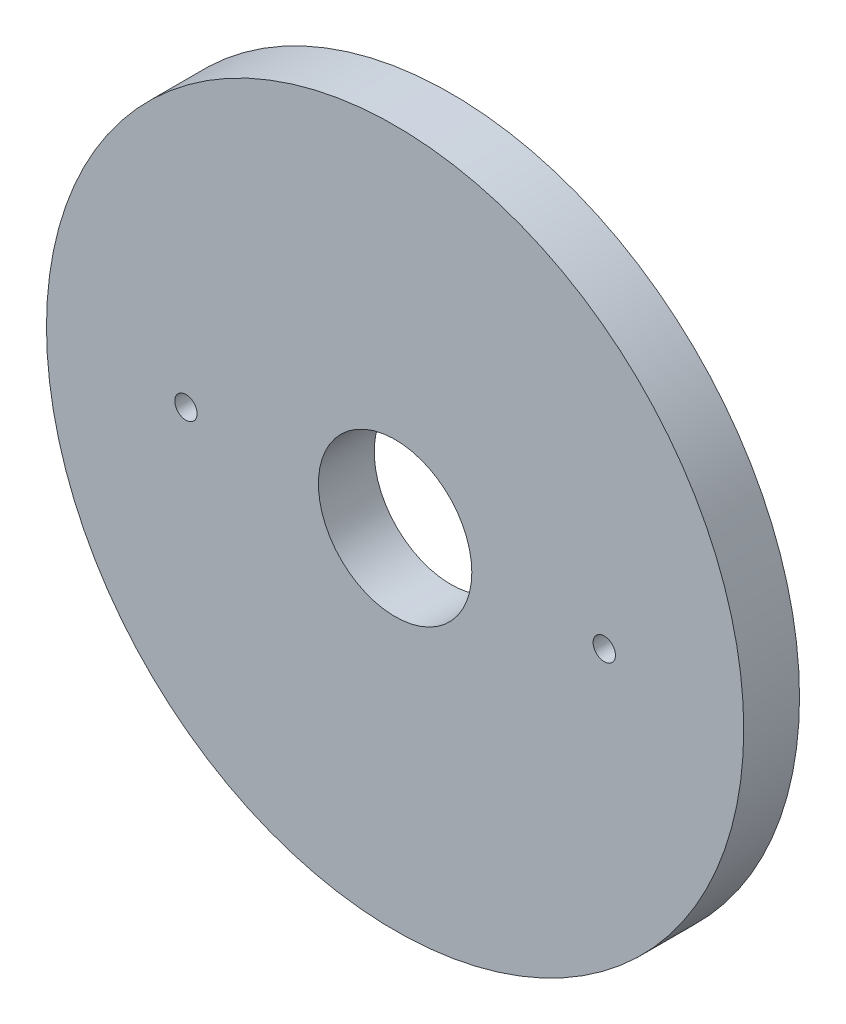
ISO-10303-21;
HEADER;
FILE_DESCRIPTION(('STEP AP214'),'2;1');
FILE_NAME('part.step','',(''),(''),'','','');
FILE_SCHEMA(('AUTOMOTIVE_DESIGN { 1 0 10303 214 1 1 1 1 }'));
ENDSEC;
DATA;
#1=APPLICATION_CONTEXT('core data for automotive mechanical design processes');
#2=APPLICATION_PROTOCOL_DEFINITION('international standard','automotive_design',2000,#1);
#3=PRODUCT_CONTEXT('',#1,'mechanical');
#4=PRODUCT('Part','Part','',(#3));
#5=PRODUCT_RELATED_PRODUCT_CATEGORY('part','',(#4));
#6=PRODUCT_DEFINITION_FORMATION('','',#4);
#7=PRODUCT_DEFINITION_CONTEXT('part definition',#1,'design');
#8=PRODUCT_DEFINITION('design','',#6,#7);
#9=PRODUCT_DEFINITION_SHAPE('','',#8);
#10=(LENGTH_UNIT() NAMED_UNIT(*) SI_UNIT(.MILLI.,.METRE.));
#11=(NAMED_UNIT(*) PLANE_ANGLE_UNIT() SI_UNIT($,.RADIAN.));
#12=(NAMED_UNIT(*) SI_UNIT($,.STERADIAN.) SOLID_ANGLE_UNIT());
#13=UNCERTAINTY_MEASURE_WITH_UNIT(LENGTH_MEASURE(1.E-05),#10,'distance_accuracy_value','');
#14=(GEOMETRIC_REPRESENTATION_CONTEXT(3) GLOBAL_UNCERTAINTY_ASSIGNED_CONTEXT((#13)) GLOBAL_UNIT_ASSIGNED_CONTEXT((#10,
#11,#12)) REPRESENTATION_CONTEXT('',''));
#15=CARTESIAN_POINT('',(0.,0.,0.));
#16=DIRECTION('',(0.,0.,1.));
#17=DIRECTION('',(1.,0.,0.));
#18=AXIS2_PLACEMENT_3D('',#15,#16,#17);
#19=CARTESIAN_POINT('',(30.,0.,8.));
#20=DIRECTION('',(0.,0.,-1.));
#21=DIRECTION('',(-1.,0.,0.));
#22=AXIS2_PLACEMENT_3D('',#19,#20,#21);
#23=CYLINDRICAL_SURFACE('',#22,1.6);
#24=CARTESIAN_POINT('',(30.,0.,8.));
#25=DIRECTION('',(0.,0.,-1.));
#26=DIRECTION('',(-1.,0.,0.));
#27=AXIS2_PLACEMENT_3D('',#24,#25,#26);
#28=CIRCLE('',#27,1.6);
#29=CARTESIAN_POINT('',(28.4,0.,8.));
#30=VERTEX_POINT('',#29);
#31=EDGE_CURVE('E55',#30,#30,#28,.T.);
#32=ORIENTED_EDGE('',*,*,#31,.F.);
#33=EDGE_LOOP('',(#32));
#34=FACE_BOUND('',#33,.T.);
#35=CARTESIAN_POINT('',(30.,0.,3.));
#36=DIRECTION('',(0.,0.,-1.));
#37=DIRECTION('',(-1.,0.,0.));
#38=AXIS2_PLACEMENT_3D('',#35,#36,#37);
#39=CIRCLE('',#38,1.6);
#40=CARTESIAN_POINT('',(28.4,0.,3.));
#41=VERTEX_POINT('',#40);
#42=EDGE_CURVE('E35',#41,#41,#39,.F.);
#43=ORIENTED_EDGE('',*,*,#42,.F.);
#44=EDGE_LOOP('',(#43));
#45=FACE_BOUND('',#44,.T.);
#46=ADVANCED_FACE('F31',(#34,#45),#23,.F.);
#47=CARTESIAN_POINT('',(-30.,0.,8.));
#48=DIRECTION('',(0.,0.,-1.));
#49=DIRECTION('',(-1.,0.,0.));
#50=AXIS2_PLACEMENT_3D('',#47,#48,#49);
#51=CYLINDRICAL_SURFACE('',#50,1.6);
#52=CARTESIAN_POINT('',(-30.,0.,8.));
#53=DIRECTION('',(0.,0.,-1.));
#54=DIRECTION('',(-1.,0.,0.));
#55=AXIS2_PLACEMENT_3D('',#52,#53,#54);
#56=CIRCLE('',#55,1.6);
#57=CARTESIAN_POINT('',(-31.6,0.,8.));
#58=VERTEX_POINT('',#57);
#59=EDGE_CURVE('E70',#58,#58,#56,.T.);
#60=ORIENTED_EDGE('',*,*,#59,.F.);
#61=EDGE_LOOP('',(#60));
#62=FACE_BOUND('',#61,.T.);
#63=CARTESIAN_POINT('',(-30.,0.,3.));
#64=DIRECTION('',(0.,0.,-1.));
#65=DIRECTION('',(-1.,0.,0.));
#66=AXIS2_PLACEMENT_3D('',#63,#64,#65);
#67=CIRCLE('',#66,1.6);
#68=CARTESIAN_POINT('',(-31.6,0.,3.));
#69=VERTEX_POINT('',#68);
#70=EDGE_CURVE('E49',#69,#69,#67,.F.);
#71=ORIENTED_EDGE('',*,*,#70,.F.);
#72=EDGE_LOOP('',(#71));
#73=FACE_BOUND('',#72,.T.);
#74=ADVANCED_FACE('F96',(#62,#73),#51,.F.);
#75=CARTESIAN_POINT('',(0.,0.,8.));
#76=DIRECTION('',(0.,0.,1.));
#77=DIRECTION('',(1.,0.,0.));
#78=AXIS2_PLACEMENT_3D('',#75,#76,#77);
#79=PLANE('',#78);
#80=ORIENTED_EDGE('',*,*,#59,.T.);
#81=EDGE_LOOP('',(#80));
#82=FACE_BOUND('',#81,.T.);
#83=ORIENTED_EDGE('',*,*,#31,.T.);
#84=EDGE_LOOP('',(#83));
#85=FACE_BOUND('',#84,.T.);
#86=CARTESIAN_POINT('',(0.,0.,8.));
#87=DIRECTION('',(0.,0.,1.));
#88=DIRECTION('',(1.,0.,0.));
#89=AXIS2_PLACEMENT_3D('',#86,#87,#88);
#90=CIRCLE('',#89,50.);
#91=CARTESIAN_POINT('',(50.,0.,8.));
#92=VERTEX_POINT('',#91);
#93=EDGE_CURVE('E10',#92,#92,#90,.T.);
#94=ORIENTED_EDGE('',*,*,#93,.T.);
#95=EDGE_LOOP('',(#94));
#96=FACE_BOUND('',#95,.T.);
#97=CARTESIAN_POINT('',(0.,0.,8.));
#98=DIRECTION('',(0.,0.,1.));
#99=DIRECTION('',(1.,0.,0.));
#100=AXIS2_PLACEMENT_3D('',#97,#98,#99);
#101=CIRCLE('',#100,11.);
#102=CARTESIAN_POINT('',(11.,0.,8.));
#103=VERTEX_POINT('',#102);
#104=EDGE_CURVE('E44',#103,#103,#101,.T.);
#105=ORIENTED_EDGE('',*,*,#104,.F.);
#106=EDGE_LOOP('',(#105));
#107=FACE_BOUND('',#106,.T.);
#108=ADVANCED_FACE('F101',(#82,#85,#96,#107),#79,.T.);
#109=CARTESIAN_POINT('',(0.,0.,0.));
#110=DIRECTION('',(0.,0.,1.));
#111=DIRECTION('',(1.,0.,0.));
#112=AXIS2_PLACEMENT_3D('',#109,#110,#111);
#113=PLANE('',#112);
#114=CARTESIAN_POINT('',(-30.,0.,0.));
#115=DIRECTION('',(0.,0.,-1.));
#116=DIRECTION('',(-1.,0.,0.));
#117=AXIS2_PLACEMENT_3D('',#114,#115,#116);
#118=CIRCLE('',#117,2.85);
#119=CARTESIAN_POINT('',(-32.85,0.,0.));
#120=VERTEX_POINT('',#119);
#121=EDGE_CURVE('E57',#120,#120,#118,.T.);
#122=ORIENTED_EDGE('',*,*,#121,.F.);
#123=EDGE_LOOP('',(#122));
#124=FACE_BOUND('',#123,.T.);
#125=CARTESIAN_POINT('',(30.,0.,0.));
#126=DIRECTION('',(0.,0.,-1.));
#127=DIRECTION('',(-1.,0.,0.));
#128=AXIS2_PLACEMENT_3D('',#125,#126,#127);
#129=CIRCLE('',#128,2.85);
#130=CARTESIAN_POINT('',(27.15,0.,0.));
#131=VERTEX_POINT('',#130);
#132=EDGE_CURVE('E67',#131,#131,#129,.T.);
#133=ORIENTED_EDGE('',*,*,#132,.F.);
#134=EDGE_LOOP('',(#133));
#135=FACE_BOUND('',#134,.T.);
#136=CARTESIAN_POINT('',(0.,0.,0.));
#137=DIRECTION('',(0.,0.,1.));
#138=DIRECTION('',(1.,0.,0.));
#139=AXIS2_PLACEMENT_3D('',#136,#137,#138);
#140=CIRCLE('',#139,50.);
#141=CARTESIAN_POINT('',(50.,0.,0.));
#142=VERTEX_POINT('',#141);
#143=EDGE_CURVE('E39',#142,#142,#140,.T.);
#144=ORIENTED_EDGE('',*,*,#143,.F.);
#145=EDGE_LOOP('',(#144));
#146=FACE_BOUND('',#145,.T.);
#147=CARTESIAN_POINT('',(0.,0.,0.));
#148=DIRECTION('',(0.,0.,1.));
#149=DIRECTION('',(1.,0.,0.));
#150=AXIS2_PLACEMENT_3D('',#147,#148,#149);
#151=CIRCLE('',#150,11.);
#152=CARTESIAN_POINT('',(11.,0.,0.));
#153=VERTEX_POINT('',#152);
#154=EDGE_CURVE('E47',#153,#153,#151,.T.);
#155=ORIENTED_EDGE('',*,*,#154,.T.);
#156=EDGE_LOOP('',(#155));
#157=FACE_BOUND('',#156,.T.);
#158=ADVANCED_FACE('F80',(#124,#135,#146,#157),#113,.F.);
#159=CARTESIAN_POINT('',(0.,0.,8.));
#160=DIRECTION('',(0.,0.,-1.));
#161=DIRECTION('',(-1.,0.,0.));
#162=AXIS2_PLACEMENT_3D('',#159,#160,#161);
#163=CYLINDRICAL_SURFACE('',#162,50.);
#164=ORIENTED_EDGE('',*,*,#93,.F.);
#165=EDGE_LOOP('',(#164));
#166=FACE_BOUND('',#165,.T.);
#167=ORIENTED_EDGE('',*,*,#143,.T.);
#168=EDGE_LOOP('',(#167));
#169=FACE_BOUND('',#168,.T.);
#170=ADVANCED_FACE('F33',(#166,#169),#163,.T.);
#171=CARTESIAN_POINT('',(0.,0.,8.));
#172=DIRECTION('',(0.,0.,-1.));
#173=DIRECTION('',(-1.,0.,0.));
#174=AXIS2_PLACEMENT_3D('',#171,#172,#173);
#175=CYLINDRICAL_SURFACE('',#174,11.);
#176=ORIENTED_EDGE('',*,*,#104,.T.);
#177=EDGE_LOOP('',(#176));
#178=FACE_BOUND('',#177,.T.);
#179=ORIENTED_EDGE('',*,*,#154,.F.);
#180=EDGE_LOOP('',(#179));
#181=FACE_BOUND('',#180,.T.);
#182=ADVANCED_FACE('F82',(#178,#181),#175,.F.);
#183=CARTESIAN_POINT('',(-30.,0.,3.));
#184=DIRECTION('',(0.,0.,-1.));
#185=DIRECTION('',(-1.,0.,0.));
#186=AXIS2_PLACEMENT_3D('',#183,#184,#185);
#187=PLANE('',#186);
#188=CARTESIAN_POINT('',(-30.,0.,3.));
#189=DIRECTION('',(0.,0.,-1.));
#190=DIRECTION('',(-1.,0.,0.));
#191=AXIS2_PLACEMENT_3D('',#188,#189,#190);
#192=CIRCLE('',#191,2.85);
#193=CARTESIAN_POINT('',(-32.85,0.,3.));
#194=VERTEX_POINT('',#193);
#195=EDGE_CURVE('E51',#194,#194,#192,.T.);
#196=ORIENTED_EDGE('',*,*,#195,.T.);
#197=EDGE_LOOP('',(#196));
#198=FACE_BOUND('',#197,.T.);
#199=ORIENTED_EDGE('',*,*,#70,.T.);
#200=EDGE_LOOP('',(#199));
#201=FACE_BOUND('',#200,.T.);
#202=ADVANCED_FACE('F84',(#198,#201),#187,.T.);
#203=CARTESIAN_POINT('',(-30.,0.,3.));
#204=DIRECTION('',(0.,0.,-1.));
#205=DIRECTION('',(-1.,0.,0.));
#206=AXIS2_PLACEMENT_3D('',#203,#204,#205);
#207=CYLINDRICAL_SURFACE('',#206,2.85);
#208=ORIENTED_EDGE('',*,*,#195,.F.);
#209=EDGE_LOOP('',(#208));
#210=FACE_BOUND('',#209,.T.);
#211=ORIENTED_EDGE('',*,*,#121,.T.);
#212=EDGE_LOOP('',(#211));
#213=FACE_BOUND('',#212,.T.);
#214=ADVANCED_FACE('F91',(#210,#213),#207,.F.);
#215=CARTESIAN_POINT('',(30.,0.,3.));
#216=DIRECTION('',(0.,0.,-1.));
#217=DIRECTION('',(-1.,0.,0.));
#218=AXIS2_PLACEMENT_3D('',#215,#216,#217);
#219=PLANE('',#218);
#220=CARTESIAN_POINT('',(30.,0.,3.));
#221=DIRECTION('',(0.,0.,-1.));
#222=DIRECTION('',(-1.,0.,0.));
#223=AXIS2_PLACEMENT_3D('',#220,#221,#222);
#224=CIRCLE('',#223,2.85);
#225=CARTESIAN_POINT('',(27.15,0.,3.));
#226=VERTEX_POINT('',#225);
#227=EDGE_CURVE('E62',#226,#226,#224,.T.);
#228=ORIENTED_EDGE('',*,*,#227,.T.);
#229=EDGE_LOOP('',(#228));
#230=FACE_BOUND('',#229,.T.);
#231=ORIENTED_EDGE('',*,*,#42,.T.);
#232=EDGE_LOOP('',(#231));
#233=FACE_BOUND('',#232,.T.);
#234=ADVANCED_FACE('F110',(#230,#233),#219,.T.);
#235=CARTESIAN_POINT('',(30.,0.,3.));
#236=DIRECTION('',(0.,0.,-1.));
#237=DIRECTION('',(-1.,0.,0.));
#238=AXIS2_PLACEMENT_3D('',#235,#236,#237);
#239=CYLINDRICAL_SURFACE('',#238,2.85);
#240=ORIENTED_EDGE('',*,*,#227,.F.);
#241=EDGE_LOOP('',(#240));
#242=FACE_BOUND('',#241,.T.);
#243=ORIENTED_EDGE('',*,*,#132,.T.);
#244=EDGE_LOOP('',(#243));
#245=FACE_BOUND('',#244,.T.);
#246=ADVANCED_FACE('F107',(#242,#245),#239,.F.);
#247=CLOSED_SHELL('',(#46,#74,#108,#158,#170,#182,#202,#214,#234,#246));
#248=MANIFOLD_SOLID_BREP('B2',#247);
#249=ADVANCED_BREP_SHAPE_REPRESENTATION('',(#18,#248),#14);
#250=SHAPE_DEFINITION_REPRESENTATION(#9,#249);
ENDSEC;
END-ISO-10303-21;
